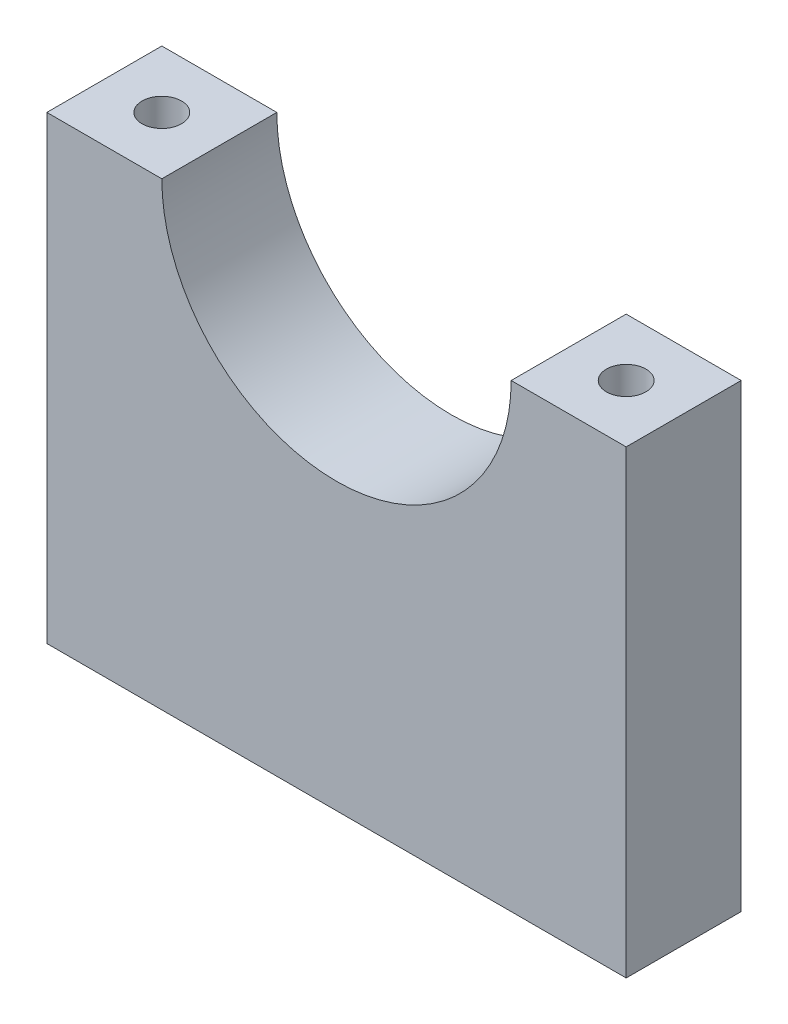
ISO-10303-21;
HEADER;
FILE_DESCRIPTION(('STEP AP214'),'2;1');
FILE_NAME('part.step','',(''),(''),'','','');
FILE_SCHEMA(('AUTOMOTIVE_DESIGN { 1 0 10303 214 1 1 1 1 }'));
ENDSEC;
DATA;
#1=APPLICATION_CONTEXT('core data for automotive mechanical design processes');
#2=APPLICATION_PROTOCOL_DEFINITION('international standard','automotive_design',2000,#1);
#3=PRODUCT_CONTEXT('',#1,'mechanical');
#4=PRODUCT('Part','Part','',(#3));
#5=PRODUCT_RELATED_PRODUCT_CATEGORY('part','',(#4));
#6=PRODUCT_DEFINITION_FORMATION('','',#4);
#7=PRODUCT_DEFINITION_CONTEXT('part definition',#1,'design');
#8=PRODUCT_DEFINITION('design','',#6,#7);
#9=PRODUCT_DEFINITION_SHAPE('','',#8);
#10=(LENGTH_UNIT() NAMED_UNIT(*) SI_UNIT(.MILLI.,.METRE.));
#11=(NAMED_UNIT(*) PLANE_ANGLE_UNIT() SI_UNIT($,.RADIAN.));
#12=(NAMED_UNIT(*) SI_UNIT($,.STERADIAN.) SOLID_ANGLE_UNIT());
#13=UNCERTAINTY_MEASURE_WITH_UNIT(LENGTH_MEASURE(1.E-05),#10,'distance_accuracy_value','');
#14=(GEOMETRIC_REPRESENTATION_CONTEXT(3) GLOBAL_UNCERTAINTY_ASSIGNED_CONTEXT((#13)) GLOBAL_UNIT_ASSIGNED_CONTEXT((#10,
#11,#12)) REPRESENTATION_CONTEXT('',''));
#15=CARTESIAN_POINT('',(0.,0.,0.));
#16=DIRECTION('',(0.,0.,1.));
#17=DIRECTION('',(1.,0.,0.));
#18=AXIS2_PLACEMENT_3D('',#15,#16,#17);
#19=CARTESIAN_POINT('',(-31.9913,0.,12.7));
#20=DIRECTION('',(1.,0.,0.));
#21=DIRECTION('',(0.,1.,0.));
#22=AXIS2_PLACEMENT_3D('',#19,#20,#21);
#23=PLANE('',#22);
#24=DIRECTION('',(0.,-1.,0.));
#25=VECTOR('',#24,1.);
#26=CARTESIAN_POINT('',(-31.9913,0.,0.));
#27=LINE('',#26,#25);
#28=CARTESIAN_POINT('',(-31.9913,0.,0.));
#29=VERTEX_POINT('',#28);
#30=CARTESIAN_POINT('',(-31.9913,-50.8,0.));
#31=VERTEX_POINT('',#30);
#32=EDGE_CURVE('E117',#29,#31,#27,.T.);
#33=ORIENTED_EDGE('',*,*,#32,.T.);
#34=DIRECTION('',(0.,0.,-1.));
#35=VECTOR('',#34,1.);
#36=CARTESIAN_POINT('',(-31.9913,-50.8,12.7));
#37=LINE('',#36,#35);
#38=CARTESIAN_POINT('',(-31.9913,-50.8,12.7));
#39=VERTEX_POINT('',#38);
#40=EDGE_CURVE('E11',#39,#31,#37,.T.);
#41=ORIENTED_EDGE('',*,*,#40,.F.);
#42=DIRECTION('',(0.,-1.,0.));
#43=VECTOR('',#42,1.);
#44=CARTESIAN_POINT('',(-31.9913,0.,12.7));
#45=LINE('',#44,#43);
#46=CARTESIAN_POINT('',(-31.9913,0.,12.7));
#47=VERTEX_POINT('',#46);
#48=EDGE_CURVE('E132',#47,#39,#45,.T.);
#49=ORIENTED_EDGE('',*,*,#48,.F.);
#50=DIRECTION('',(0.,0.,-1.));
#51=VECTOR('',#50,1.);
#52=CARTESIAN_POINT('',(-31.9913,0.,12.7));
#53=LINE('',#52,#51);
#54=EDGE_CURVE('E49',#47,#29,#53,.T.);
#55=ORIENTED_EDGE('',*,*,#54,.T.);
#56=EDGE_LOOP('',(#33,#41,#49,#55));
#57=FACE_BOUND('',#56,.T.);
#58=ADVANCED_FACE('F33',(#57),#23,.F.);
#59=CARTESIAN_POINT('',(-31.9913,-50.8,12.7));
#60=DIRECTION('',(0.,1.,0.));
#61=DIRECTION('',(-1.,0.,0.));
#62=AXIS2_PLACEMENT_3D('',#59,#60,#61);
#63=PLANE('',#62);
#64=CARTESIAN_POINT('',(25.6413,-50.8,6.35));
#65=DIRECTION('',(0.,-1.,0.));
#66=DIRECTION('',(1.,0.,0.));
#67=AXIS2_PLACEMENT_3D('',#64,#65,#66);
#68=CIRCLE('',#67,2.1828125);
#69=CARTESIAN_POINT('',(27.8241125,-50.8,6.35));
#70=VERTEX_POINT('',#69);
#71=EDGE_CURVE('E167',#70,#70,#68,.T.);
#72=ORIENTED_EDGE('',*,*,#71,.F.);
#73=EDGE_LOOP('',(#72));
#74=FACE_BOUND('',#73,.T.);
#75=CARTESIAN_POINT('',(-25.6413,-50.8,6.35));
#76=DIRECTION('',(0.,-1.,0.));
#77=DIRECTION('',(1.,0.,0.));
#78=AXIS2_PLACEMENT_3D('',#75,#76,#77);
#79=CIRCLE('',#78,2.1828125);
#80=CARTESIAN_POINT('',(-23.4584875,-50.8,6.35));
#81=VERTEX_POINT('',#80);
#82=EDGE_CURVE('E162',#81,#81,#79,.T.);
#83=ORIENTED_EDGE('',*,*,#82,.F.);
#84=EDGE_LOOP('',(#83));
#85=FACE_BOUND('',#84,.T.);
#86=DIRECTION('',(1.,0.,0.));
#87=VECTOR('',#86,1.);
#88=CARTESIAN_POINT('',(-31.9913,-50.8,0.));
#89=LINE('',#88,#87);
#90=CARTESIAN_POINT('',(31.9913,-50.8,0.));
#91=VERTEX_POINT('',#90);
#92=EDGE_CURVE('E119',#31,#91,#89,.T.);
#93=ORIENTED_EDGE('',*,*,#92,.T.);
#94=DIRECTION('',(0.,0.,-1.));
#95=VECTOR('',#94,1.);
#96=CARTESIAN_POINT('',(31.9913,-50.8,12.7));
#97=LINE('',#96,#95);
#98=CARTESIAN_POINT('',(31.9913,-50.8,12.7));
#99=VERTEX_POINT('',#98);
#100=EDGE_CURVE('E41',#99,#91,#97,.T.);
#101=ORIENTED_EDGE('',*,*,#100,.F.);
#102=DIRECTION('',(1.,0.,0.));
#103=VECTOR('',#102,1.);
#104=CARTESIAN_POINT('',(-31.9913,-50.8,12.7));
#105=LINE('',#104,#103);
#106=EDGE_CURVE('E81',#39,#99,#105,.T.);
#107=ORIENTED_EDGE('',*,*,#106,.F.);
#108=ORIENTED_EDGE('',*,*,#40,.T.);
#109=EDGE_LOOP('',(#93,#101,#107,#108));
#110=FACE_BOUND('',#109,.T.);
#111=ADVANCED_FACE('F138',(#74,#85,#110),#63,.F.);
#112=CARTESIAN_POINT('',(31.9913,0.,12.7));
#113=DIRECTION('',(1.,0.,0.));
#114=DIRECTION('',(0.,0.,-1.));
#115=AXIS2_PLACEMENT_3D('',#112,#113,#114);
#116=PLANE('',#115);
#117=DIRECTION('',(0.,-1.,0.));
#118=VECTOR('',#117,1.);
#119=CARTESIAN_POINT('',(31.9913,0.,0.));
#120=LINE('',#119,#118);
#121=CARTESIAN_POINT('',(31.9913,0.,0.));
#122=VERTEX_POINT('',#121);
#123=EDGE_CURVE('E123',#122,#91,#120,.T.);
#124=ORIENTED_EDGE('',*,*,#123,.F.);
#125=DIRECTION('',(0.,0.,-1.));
#126=VECTOR('',#125,1.);
#127=CARTESIAN_POINT('',(31.9913,0.,12.7));
#128=LINE('',#127,#126);
#129=CARTESIAN_POINT('',(31.9913,0.,12.7));
#130=VERTEX_POINT('',#129);
#131=EDGE_CURVE('E109',#130,#122,#128,.T.);
#132=ORIENTED_EDGE('',*,*,#131,.F.);
#133=DIRECTION('',(0.,-1.,0.));
#134=VECTOR('',#133,1.);
#135=CARTESIAN_POINT('',(31.9913,0.,12.7));
#136=LINE('',#135,#134);
#137=EDGE_CURVE('E99',#130,#99,#136,.T.);
#138=ORIENTED_EDGE('',*,*,#137,.T.);
#139=ORIENTED_EDGE('',*,*,#100,.T.);
#140=EDGE_LOOP('',(#124,#132,#138,#139));
#141=FACE_BOUND('',#140,.T.);
#142=ADVANCED_FACE('F137',(#141),#116,.T.);
#143=CARTESIAN_POINT('',(31.9913,0.,12.7));
#144=DIRECTION('',(0.,-1.,0.));
#145=DIRECTION('',(1.,0.,0.));
#146=AXIS2_PLACEMENT_3D('',#143,#144,#145);
#147=PLANE('',#146);
#148=CARTESIAN_POINT('',(25.6413,0.,6.35));
#149=DIRECTION('',(0.,-1.,0.));
#150=DIRECTION('',(1.,0.,0.));
#151=AXIS2_PLACEMENT_3D('',#148,#149,#150);
#152=CIRCLE('',#151,2.1828125);
#153=CARTESIAN_POINT('',(27.8241125,0.,6.35));
#154=VERTEX_POINT('',#153);
#155=EDGE_CURVE('E165',#154,#154,#152,.T.);
#156=ORIENTED_EDGE('',*,*,#155,.T.);
#157=EDGE_LOOP('',(#156));
#158=FACE_BOUND('',#157,.T.);
#159=DIRECTION('',(-1.,0.,0.));
#160=VECTOR('',#159,1.);
#161=CARTESIAN_POINT('',(31.9913,0.,0.));
#162=LINE('',#161,#160);
#163=CARTESIAN_POINT('',(19.2913,0.,0.));
#164=VERTEX_POINT('',#163);
#165=EDGE_CURVE('E106',#122,#164,#162,.T.);
#166=ORIENTED_EDGE('',*,*,#165,.T.);
#167=DIRECTION('',(0.,0.,-1.));
#168=VECTOR('',#167,1.);
#169=CARTESIAN_POINT('',(19.2913,0.,12.7));
#170=LINE('',#169,#168);
#171=CARTESIAN_POINT('',(19.2913,0.,12.7));
#172=VERTEX_POINT('',#171);
#173=EDGE_CURVE('E103',#172,#164,#170,.T.);
#174=ORIENTED_EDGE('',*,*,#173,.F.);
#175=DIRECTION('',(-1.,0.,0.));
#176=VECTOR('',#175,1.);
#177=CARTESIAN_POINT('',(31.9913,0.,12.7));
#178=LINE('',#177,#176);
#179=EDGE_CURVE('E92',#130,#172,#178,.T.);
#180=ORIENTED_EDGE('',*,*,#179,.F.);
#181=ORIENTED_EDGE('',*,*,#131,.T.);
#182=EDGE_LOOP('',(#166,#174,#180,#181));
#183=FACE_BOUND('',#182,.T.);
#184=ADVANCED_FACE('F104',(#158,#183),#147,.F.);
#185=CARTESIAN_POINT('',(0.,0.,12.7));
#186=DIRECTION('',(0.,0.,-1.));
#187=DIRECTION('',(-1.,0.,0.));
#188=AXIS2_PLACEMENT_3D('',#185,#186,#187);
#189=CYLINDRICAL_SURFACE('',#188,19.2913);
#190=CARTESIAN_POINT('',(0.,0.,0.));
#191=DIRECTION('',(0.,0.,1.));
#192=DIRECTION('',(1.,0.,0.));
#193=AXIS2_PLACEMENT_3D('',#190,#191,#192);
#194=CIRCLE('',#193,19.2913);
#195=CARTESIAN_POINT('',(-19.2913,0.,0.));
#196=VERTEX_POINT('',#195);
#197=EDGE_CURVE('E127',#196,#164,#194,.T.);
#198=ORIENTED_EDGE('',*,*,#197,.F.);
#199=DIRECTION('',(0.,0.,-1.));
#200=VECTOR('',#199,1.);
#201=CARTESIAN_POINT('',(-19.2913,0.,12.7));
#202=LINE('',#201,#200);
#203=CARTESIAN_POINT('',(-19.2913,0.,12.7));
#204=VERTEX_POINT('',#203);
#205=EDGE_CURVE('E69',#204,#196,#202,.T.);
#206=ORIENTED_EDGE('',*,*,#205,.F.);
#207=CARTESIAN_POINT('',(0.,0.,12.7));
#208=DIRECTION('',(0.,0.,1.));
#209=DIRECTION('',(1.,0.,0.));
#210=AXIS2_PLACEMENT_3D('',#207,#208,#209);
#211=CIRCLE('',#210,19.2913);
#212=EDGE_CURVE('E97',#204,#172,#211,.T.);
#213=ORIENTED_EDGE('',*,*,#212,.T.);
#214=ORIENTED_EDGE('',*,*,#173,.T.);
#215=EDGE_LOOP('',(#198,#206,#213,#214));
#216=FACE_BOUND('',#215,.T.);
#217=ADVANCED_FACE('F111',(#216),#189,.F.);
#218=CARTESIAN_POINT('',(-31.9913,0.,12.7));
#219=DIRECTION('',(0.,1.,0.));
#220=DIRECTION('',(0.,0.,1.));
#221=AXIS2_PLACEMENT_3D('',#218,#219,#220);
#222=PLANE('',#221);
#223=CARTESIAN_POINT('',(-25.6413,0.,6.35));
#224=DIRECTION('',(0.,-1.,0.));
#225=DIRECTION('',(1.,0.,0.));
#226=AXIS2_PLACEMENT_3D('',#223,#224,#225);
#227=CIRCLE('',#226,2.1828125);
#228=CARTESIAN_POINT('',(-23.4584875,0.,6.35));
#229=VERTEX_POINT('',#228);
#230=EDGE_CURVE('E120',#229,#229,#227,.T.);
#231=ORIENTED_EDGE('',*,*,#230,.T.);
#232=EDGE_LOOP('',(#231));
#233=FACE_BOUND('',#232,.T.);
#234=DIRECTION('',(1.,0.,0.));
#235=VECTOR('',#234,1.);
#236=CARTESIAN_POINT('',(-31.9913,0.,0.));
#237=LINE('',#236,#235);
#238=EDGE_CURVE('E129',#29,#196,#237,.T.);
#239=ORIENTED_EDGE('',*,*,#238,.F.);
#240=ORIENTED_EDGE('',*,*,#54,.F.);
#241=DIRECTION('',(1.,0.,0.));
#242=VECTOR('',#241,1.);
#243=CARTESIAN_POINT('',(-31.9913,0.,12.7));
#244=LINE('',#243,#242);
#245=EDGE_CURVE('E112',#47,#204,#244,.T.);
#246=ORIENTED_EDGE('',*,*,#245,.T.);
#247=ORIENTED_EDGE('',*,*,#205,.T.);
#248=EDGE_LOOP('',(#239,#240,#246,#247));
#249=FACE_BOUND('',#248,.T.);
#250=ADVANCED_FACE('F142',(#233,#249),#222,.T.);
#251=CARTESIAN_POINT('',(0.,0.,12.7));
#252=DIRECTION('',(0.,0.,1.));
#253=DIRECTION('',(1.,0.,0.));
#254=AXIS2_PLACEMENT_3D('',#251,#252,#253);
#255=PLANE('',#254);
#256=ORIENTED_EDGE('',*,*,#48,.T.);
#257=ORIENTED_EDGE('',*,*,#106,.T.);
#258=ORIENTED_EDGE('',*,*,#137,.F.);
#259=ORIENTED_EDGE('',*,*,#179,.T.);
#260=ORIENTED_EDGE('',*,*,#212,.F.);
#261=ORIENTED_EDGE('',*,*,#245,.F.);
#262=EDGE_LOOP('',(#256,#257,#258,#259,#260,#261));
#263=FACE_BOUND('',#262,.T.);
#264=ADVANCED_FACE('F94',(#263),#255,.T.);
#265=CARTESIAN_POINT('',(0.,0.,0.));
#266=DIRECTION('',(0.,0.,1.));
#267=DIRECTION('',(1.,0.,0.));
#268=AXIS2_PLACEMENT_3D('',#265,#266,#267);
#269=PLANE('',#268);
#270=ORIENTED_EDGE('',*,*,#32,.F.);
#271=ORIENTED_EDGE('',*,*,#238,.T.);
#272=ORIENTED_EDGE('',*,*,#197,.T.);
#273=ORIENTED_EDGE('',*,*,#165,.F.);
#274=ORIENTED_EDGE('',*,*,#123,.T.);
#275=ORIENTED_EDGE('',*,*,#92,.F.);
#276=EDGE_LOOP('',(#270,#271,#272,#273,#274,#275));
#277=FACE_BOUND('',#276,.T.);
#278=ADVANCED_FACE('F141',(#277),#269,.F.);
#279=CARTESIAN_POINT('',(-25.6413,0.,6.35));
#280=DIRECTION('',(0.,-1.,0.));
#281=DIRECTION('',(1.,0.,0.));
#282=AXIS2_PLACEMENT_3D('',#279,#280,#281);
#283=CYLINDRICAL_SURFACE('',#282,2.1828125);
#284=ORIENTED_EDGE('',*,*,#230,.F.);
#285=EDGE_LOOP('',(#284));
#286=FACE_BOUND('',#285,.T.);
#287=ORIENTED_EDGE('',*,*,#82,.T.);
#288=EDGE_LOOP('',(#287));
#289=FACE_BOUND('',#288,.T.);
#290=ADVANCED_FACE('F177',(#286,#289),#283,.F.);
#291=CARTESIAN_POINT('',(25.6413,0.,6.35));
#292=DIRECTION('',(0.,-1.,0.));
#293=DIRECTION('',(1.,0.,0.));
#294=AXIS2_PLACEMENT_3D('',#291,#292,#293);
#295=CYLINDRICAL_SURFACE('',#294,2.1828125);
#296=ORIENTED_EDGE('',*,*,#155,.F.);
#297=EDGE_LOOP('',(#296));
#298=FACE_BOUND('',#297,.T.);
#299=ORIENTED_EDGE('',*,*,#71,.T.);
#300=EDGE_LOOP('',(#299));
#301=FACE_BOUND('',#300,.T.);
#302=ADVANCED_FACE('F174',(#298,#301),#295,.F.);
#303=CLOSED_SHELL('',(#58,#111,#142,#184,#217,#250,#264,#278,#290,#302));
#304=MANIFOLD_SOLID_BREP('B2',#303);
#305=ADVANCED_BREP_SHAPE_REPRESENTATION('',(#18,#304),#14);
#306=SHAPE_DEFINITION_REPRESENTATION(#9,#305);
ENDSEC;
END-ISO-10303-21;
